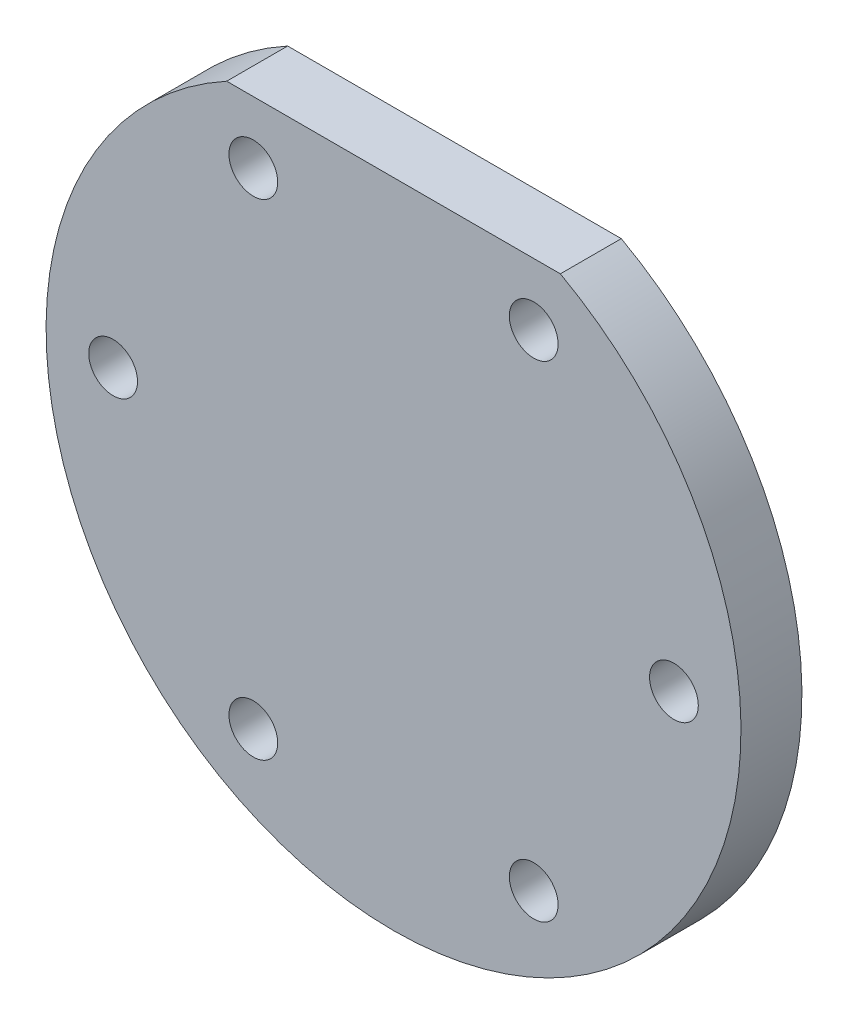
ISO-10303-21;
HEADER;
FILE_DESCRIPTION(('STEP AP214'),'2;1');
FILE_NAME('part.step','',(''),(''),'','','');
FILE_SCHEMA(('AUTOMOTIVE_DESIGN { 1 0 10303 214 1 1 1 1 }'));
ENDSEC;
DATA;
#1=APPLICATION_CONTEXT('core data for automotive mechanical design processes');
#2=APPLICATION_PROTOCOL_DEFINITION('international standard','automotive_design',2000,#1);
#3=PRODUCT_CONTEXT('',#1,'mechanical');
#4=PRODUCT('Part','Part','',(#3));
#5=PRODUCT_RELATED_PRODUCT_CATEGORY('part','',(#4));
#6=PRODUCT_DEFINITION_FORMATION('','',#4);
#7=PRODUCT_DEFINITION_CONTEXT('part definition',#1,'design');
#8=PRODUCT_DEFINITION('design','',#6,#7);
#9=PRODUCT_DEFINITION_SHAPE('','',#8);
#10=(LENGTH_UNIT() NAMED_UNIT(*) SI_UNIT(.MILLI.,.METRE.));
#11=(NAMED_UNIT(*) PLANE_ANGLE_UNIT() SI_UNIT($,.RADIAN.));
#12=(NAMED_UNIT(*) SI_UNIT($,.STERADIAN.) SOLID_ANGLE_UNIT());
#13=UNCERTAINTY_MEASURE_WITH_UNIT(LENGTH_MEASURE(1.E-05),#10,'distance_accuracy_value','');
#14=(GEOMETRIC_REPRESENTATION_CONTEXT(3) GLOBAL_UNCERTAINTY_ASSIGNED_CONTEXT((#13)) GLOBAL_UNIT_ASSIGNED_CONTEXT((#10,
#11,#12)) REPRESENTATION_CONTEXT('',''));
#15=CARTESIAN_POINT('',(0.,0.,0.));
#16=DIRECTION('',(0.,0.,1.));
#17=DIRECTION('',(1.,0.,0.));
#18=AXIS2_PLACEMENT_3D('',#15,#16,#17);
#19=CARTESIAN_POINT('',(0.,0.,5.));
#20=DIRECTION('',(0.,0.,1.));
#21=DIRECTION('',(1.,0.,0.));
#22=AXIS2_PLACEMENT_3D('',#19,#20,#21);
#23=PLANE('',#22);
#24=CARTESIAN_POINT('',(-11.4999999999998,19.9185842870422,5.));
#25=DIRECTION('',(0.,0.,1.));
#26=DIRECTION('',(1.,0.,0.));
#27=AXIS2_PLACEMENT_3D('',#24,#25,#26);
#28=CIRCLE('',#27,2.);
#29=CARTESIAN_POINT('',(-9.49999999999981,19.9185842870422,5.));
#30=VERTEX_POINT('',#29);
#31=EDGE_CURVE('E121',#30,#30,#28,.T.);
#32=ORIENTED_EDGE('',*,*,#31,.F.);
#33=EDGE_LOOP('',(#32));
#34=FACE_BOUND('',#33,.T.);
#35=CARTESIAN_POINT('',(-11.5000000000001,-19.918584287042,5.));
#36=DIRECTION('',(0.,0.,1.));
#37=DIRECTION('',(1.,0.,0.));
#38=AXIS2_PLACEMENT_3D('',#35,#36,#37);
#39=CIRCLE('',#38,2.00000000000001);
#40=CARTESIAN_POINT('',(-9.50000000000009,-19.918584287042,5.));
#41=VERTEX_POINT('',#40);
#42=EDGE_CURVE('E105',#41,#41,#39,.T.);
#43=ORIENTED_EDGE('',*,*,#42,.F.);
#44=EDGE_LOOP('',(#43));
#45=FACE_BOUND('',#44,.T.);
#46=CARTESIAN_POINT('',(23.,0.,5.));
#47=DIRECTION('',(0.,0.,1.));
#48=DIRECTION('',(1.,0.,0.));
#49=AXIS2_PLACEMENT_3D('',#46,#47,#48);
#50=CIRCLE('',#49,2.);
#51=CARTESIAN_POINT('',(25.,0.,5.));
#52=VERTEX_POINT('',#51);
#53=EDGE_CURVE('E86',#52,#52,#50,.T.);
#54=ORIENTED_EDGE('',*,*,#53,.F.);
#55=EDGE_LOOP('',(#54));
#56=FACE_BOUND('',#55,.T.);
#57=CARTESIAN_POINT('',(0.,0.,5.));
#58=DIRECTION('',(0.,0.,1.));
#59=DIRECTION('',(1.,0.,0.));
#60=AXIS2_PLACEMENT_3D('',#57,#58,#59);
#61=CIRCLE('',#60,28.5);
#62=CARTESIAN_POINT('',(-13.683932183404,25.,5.));
#63=VERTEX_POINT('',#62);
#64=CARTESIAN_POINT('',(13.683932183404,25.,5.));
#65=VERTEX_POINT('',#64);
#66=EDGE_CURVE('E78',#63,#65,#61,.T.);
#67=ORIENTED_EDGE('',*,*,#66,.T.);
#68=DIRECTION('',(-1.,0.,0.));
#69=VECTOR('',#68,1.);
#70=CARTESIAN_POINT('',(-13.683932183404,25.,5.));
#71=LINE('',#70,#69);
#72=EDGE_CURVE('E62',#65,#63,#71,.T.);
#73=ORIENTED_EDGE('',*,*,#72,.T.);
#74=EDGE_LOOP('',(#67,#73));
#75=FACE_BOUND('',#74,.T.);
#76=CARTESIAN_POINT('',(11.5,-19.9185842870421,5.));
#77=DIRECTION('',(0.,0.,1.));
#78=DIRECTION('',(1.,0.,0.));
#79=AXIS2_PLACEMENT_3D('',#76,#77,#78);
#80=CIRCLE('',#79,2.);
#81=CARTESIAN_POINT('',(13.5,-19.9185842870421,5.));
#82=VERTEX_POINT('',#81);
#83=EDGE_CURVE('E99',#82,#82,#80,.T.);
#84=ORIENTED_EDGE('',*,*,#83,.F.);
#85=EDGE_LOOP('',(#84));
#86=FACE_BOUND('',#85,.T.);
#87=CARTESIAN_POINT('',(-23.,1.60608141586784E-13,5.));
#88=DIRECTION('',(0.,0.,1.));
#89=DIRECTION('',(1.,0.,0.));
#90=AXIS2_PLACEMENT_3D('',#87,#88,#89);
#91=CIRCLE('',#90,2.);
#92=CARTESIAN_POINT('',(-21.,1.60608141586784E-13,5.));
#93=VERTEX_POINT('',#92);
#94=EDGE_CURVE('E113',#93,#93,#91,.T.);
#95=ORIENTED_EDGE('',*,*,#94,.F.);
#96=EDGE_LOOP('',(#95));
#97=FACE_BOUND('',#96,.T.);
#98=CARTESIAN_POINT('',(11.5000000000002,19.918584287042,5.));
#99=DIRECTION('',(0.,0.,1.));
#100=DIRECTION('',(1.,0.,0.));
#101=AXIS2_PLACEMENT_3D('',#98,#99,#100);
#102=CIRCLE('',#101,2.);
#103=CARTESIAN_POINT('',(13.5000000000002,19.918584287042,5.));
#104=VERTEX_POINT('',#103);
#105=EDGE_CURVE('E129',#104,#104,#102,.T.);
#106=ORIENTED_EDGE('',*,*,#105,.F.);
#107=EDGE_LOOP('',(#106));
#108=FACE_BOUND('',#107,.T.);
#109=ADVANCED_FACE('F45',(#34,#45,#56,#75,#86,#97,#108),#23,.T.);
#110=CARTESIAN_POINT('',(0.,0.,0.));
#111=DIRECTION('',(0.,0.,1.));
#112=DIRECTION('',(1.,0.,0.));
#113=AXIS2_PLACEMENT_3D('',#110,#111,#112);
#114=PLANE('',#113);
#115=CARTESIAN_POINT('',(0.,0.,0.));
#116=DIRECTION('',(0.,0.,1.));
#117=DIRECTION('',(1.,0.,0.));
#118=AXIS2_PLACEMENT_3D('',#115,#116,#117);
#119=CIRCLE('',#118,28.5);
#120=CARTESIAN_POINT('',(-13.683932183404,25.,0.));
#121=VERTEX_POINT('',#120);
#122=CARTESIAN_POINT('',(13.683932183404,25.,0.));
#123=VERTEX_POINT('',#122);
#124=EDGE_CURVE('E79',#121,#123,#119,.T.);
#125=ORIENTED_EDGE('',*,*,#124,.F.);
#126=DIRECTION('',(-1.,0.,0.));
#127=VECTOR('',#126,1.);
#128=CARTESIAN_POINT('',(-13.683932183404,25.,0.));
#129=LINE('',#128,#127);
#130=EDGE_CURVE('E70',#123,#121,#129,.T.);
#131=ORIENTED_EDGE('',*,*,#130,.F.);
#132=EDGE_LOOP('',(#125,#131));
#133=FACE_BOUND('',#132,.T.);
#134=CARTESIAN_POINT('',(23.,0.,0.));
#135=DIRECTION('',(0.,0.,1.));
#136=DIRECTION('',(1.,0.,0.));
#137=AXIS2_PLACEMENT_3D('',#134,#135,#136);
#138=CIRCLE('',#137,2.);
#139=CARTESIAN_POINT('',(25.,0.,0.));
#140=VERTEX_POINT('',#139);
#141=EDGE_CURVE('E90',#140,#140,#138,.T.);
#142=ORIENTED_EDGE('',*,*,#141,.T.);
#143=EDGE_LOOP('',(#142));
#144=FACE_BOUND('',#143,.T.);
#145=CARTESIAN_POINT('',(11.5,-19.9185842870421,0.));
#146=DIRECTION('',(0.,0.,1.));
#147=DIRECTION('',(1.,0.,0.));
#148=AXIS2_PLACEMENT_3D('',#145,#146,#147);
#149=CIRCLE('',#148,2.);
#150=CARTESIAN_POINT('',(13.5,-19.9185842870421,0.));
#151=VERTEX_POINT('',#150);
#152=EDGE_CURVE('E101',#151,#151,#149,.T.);
#153=ORIENTED_EDGE('',*,*,#152,.T.);
#154=EDGE_LOOP('',(#153));
#155=FACE_BOUND('',#154,.T.);
#156=CARTESIAN_POINT('',(-11.5000000000001,-19.918584287042,0.));
#157=DIRECTION('',(0.,0.,1.));
#158=DIRECTION('',(1.,0.,0.));
#159=AXIS2_PLACEMENT_3D('',#156,#157,#158);
#160=CIRCLE('',#159,2.00000000000001);
#161=CARTESIAN_POINT('',(-9.50000000000009,-19.918584287042,0.));
#162=VERTEX_POINT('',#161);
#163=EDGE_CURVE('E109',#162,#162,#160,.T.);
#164=ORIENTED_EDGE('',*,*,#163,.T.);
#165=EDGE_LOOP('',(#164));
#166=FACE_BOUND('',#165,.T.);
#167=CARTESIAN_POINT('',(-23.,1.60608141586784E-13,0.));
#168=DIRECTION('',(0.,0.,1.));
#169=DIRECTION('',(1.,0.,0.));
#170=AXIS2_PLACEMENT_3D('',#167,#168,#169);
#171=CIRCLE('',#170,2.);
#172=CARTESIAN_POINT('',(-21.,1.60608141586784E-13,0.));
#173=VERTEX_POINT('',#172);
#174=EDGE_CURVE('E117',#173,#173,#171,.T.);
#175=ORIENTED_EDGE('',*,*,#174,.T.);
#176=EDGE_LOOP('',(#175));
#177=FACE_BOUND('',#176,.T.);
#178=CARTESIAN_POINT('',(-11.4999999999998,19.9185842870422,0.));
#179=DIRECTION('',(0.,0.,1.));
#180=DIRECTION('',(1.,0.,0.));
#181=AXIS2_PLACEMENT_3D('',#178,#179,#180);
#182=CIRCLE('',#181,2.);
#183=CARTESIAN_POINT('',(-9.49999999999981,19.9185842870422,0.));
#184=VERTEX_POINT('',#183);
#185=EDGE_CURVE('E125',#184,#184,#182,.T.);
#186=ORIENTED_EDGE('',*,*,#185,.T.);
#187=EDGE_LOOP('',(#186));
#188=FACE_BOUND('',#187,.T.);
#189=CARTESIAN_POINT('',(11.5000000000002,19.918584287042,0.));
#190=DIRECTION('',(0.,0.,1.));
#191=DIRECTION('',(1.,0.,0.));
#192=AXIS2_PLACEMENT_3D('',#189,#190,#191);
#193=CIRCLE('',#192,2.);
#194=CARTESIAN_POINT('',(13.5000000000002,19.918584287042,0.));
#195=VERTEX_POINT('',#194);
#196=EDGE_CURVE('E133',#195,#195,#193,.T.);
#197=ORIENTED_EDGE('',*,*,#196,.T.);
#198=EDGE_LOOP('',(#197));
#199=FACE_BOUND('',#198,.T.);
#200=ADVANCED_FACE('F83',(#133,#144,#155,#166,#177,#188,#199),#114,.F.);
#201=CARTESIAN_POINT('',(0.,0.,5.));
#202=DIRECTION('',(0.,0.,-1.));
#203=DIRECTION('',(-1.,0.,0.));
#204=AXIS2_PLACEMENT_3D('',#201,#202,#203);
#205=CYLINDRICAL_SURFACE('',#204,28.5);
#206=ORIENTED_EDGE('',*,*,#124,.T.);
#207=DIRECTION('',(0.,0.,-1.));
#208=VECTOR('',#207,1.);
#209=CARTESIAN_POINT('',(13.683932183404,25.,5.));
#210=LINE('',#209,#208);
#211=EDGE_CURVE('E11',#65,#123,#210,.T.);
#212=ORIENTED_EDGE('',*,*,#211,.F.);
#213=ORIENTED_EDGE('',*,*,#66,.F.);
#214=DIRECTION('',(0.,0.,-1.));
#215=VECTOR('',#214,1.);
#216=CARTESIAN_POINT('',(-13.683932183404,25.,5.));
#217=LINE('',#216,#215);
#218=EDGE_CURVE('E55',#63,#121,#217,.T.);
#219=ORIENTED_EDGE('',*,*,#218,.T.);
#220=EDGE_LOOP('',(#206,#212,#213,#219));
#221=FACE_BOUND('',#220,.T.);
#222=ADVANCED_FACE('F47',(#221),#205,.T.);
#223=CARTESIAN_POINT('',(-13.683932183404,25.,5.));
#224=DIRECTION('',(0.,-1.,0.));
#225=DIRECTION('',(0.,0.,-1.));
#226=AXIS2_PLACEMENT_3D('',#223,#224,#225);
#227=PLANE('',#226);
#228=ORIENTED_EDGE('',*,*,#130,.T.);
#229=ORIENTED_EDGE('',*,*,#218,.F.);
#230=ORIENTED_EDGE('',*,*,#72,.F.);
#231=ORIENTED_EDGE('',*,*,#211,.T.);
#232=EDGE_LOOP('',(#228,#229,#230,#231));
#233=FACE_BOUND('',#232,.T.);
#234=ADVANCED_FACE('F73',(#233),#227,.F.);
#235=CARTESIAN_POINT('',(23.,0.,5.));
#236=DIRECTION('',(0.,0.,-1.));
#237=DIRECTION('',(-1.,0.,0.));
#238=AXIS2_PLACEMENT_3D('',#235,#236,#237);
#239=CYLINDRICAL_SURFACE('',#238,2.);
#240=ORIENTED_EDGE('',*,*,#53,.T.);
#241=EDGE_LOOP('',(#240));
#242=FACE_BOUND('',#241,.T.);
#243=ORIENTED_EDGE('',*,*,#141,.F.);
#244=EDGE_LOOP('',(#243));
#245=FACE_BOUND('',#244,.T.);
#246=ADVANCED_FACE('F154',(#242,#245),#239,.F.);
#247=CARTESIAN_POINT('',(11.5,-19.9185842870421,5.));
#248=DIRECTION('',(0.,0.,-1.));
#249=DIRECTION('',(-1.,0.,0.));
#250=AXIS2_PLACEMENT_3D('',#247,#248,#249);
#251=CYLINDRICAL_SURFACE('',#250,2.);
#252=ORIENTED_EDGE('',*,*,#83,.T.);
#253=EDGE_LOOP('',(#252));
#254=FACE_BOUND('',#253,.T.);
#255=ORIENTED_EDGE('',*,*,#152,.F.);
#256=EDGE_LOOP('',(#255));
#257=FACE_BOUND('',#256,.T.);
#258=ADVANCED_FACE('F161',(#254,#257),#251,.F.);
#259=CARTESIAN_POINT('',(-11.5000000000001,-19.918584287042,5.));
#260=DIRECTION('',(0.,0.,-1.));
#261=DIRECTION('',(-1.,0.,0.));
#262=AXIS2_PLACEMENT_3D('',#259,#260,#261);
#263=CYLINDRICAL_SURFACE('',#262,2.00000000000001);
#264=ORIENTED_EDGE('',*,*,#42,.T.);
#265=EDGE_LOOP('',(#264));
#266=FACE_BOUND('',#265,.T.);
#267=ORIENTED_EDGE('',*,*,#163,.F.);
#268=EDGE_LOOP('',(#267));
#269=FACE_BOUND('',#268,.T.);
#270=ADVANCED_FACE('F193',(#266,#269),#263,.F.);
#271=CARTESIAN_POINT('',(-23.,1.60608141586784E-13,5.));
#272=DIRECTION('',(0.,0.,-1.));
#273=DIRECTION('',(-1.,0.,0.));
#274=AXIS2_PLACEMENT_3D('',#271,#272,#273);
#275=CYLINDRICAL_SURFACE('',#274,2.);
#276=ORIENTED_EDGE('',*,*,#94,.T.);
#277=EDGE_LOOP('',(#276));
#278=FACE_BOUND('',#277,.T.);
#279=ORIENTED_EDGE('',*,*,#174,.F.);
#280=EDGE_LOOP('',(#279));
#281=FACE_BOUND('',#280,.T.);
#282=ADVANCED_FACE('F201',(#278,#281),#275,.F.);
#283=CARTESIAN_POINT('',(-11.4999999999998,19.9185842870422,5.));
#284=DIRECTION('',(0.,0.,-1.));
#285=DIRECTION('',(-1.,0.,0.));
#286=AXIS2_PLACEMENT_3D('',#283,#284,#285);
#287=CYLINDRICAL_SURFACE('',#286,2.);
#288=ORIENTED_EDGE('',*,*,#31,.T.);
#289=EDGE_LOOP('',(#288));
#290=FACE_BOUND('',#289,.T.);
#291=ORIENTED_EDGE('',*,*,#185,.F.);
#292=EDGE_LOOP('',(#291));
#293=FACE_BOUND('',#292,.T.);
#294=ADVANCED_FACE('F210',(#290,#293),#287,.F.);
#295=CARTESIAN_POINT('',(11.5000000000002,19.918584287042,5.));
#296=DIRECTION('',(0.,0.,-1.));
#297=DIRECTION('',(-1.,0.,0.));
#298=AXIS2_PLACEMENT_3D('',#295,#296,#297);
#299=CYLINDRICAL_SURFACE('',#298,2.);
#300=ORIENTED_EDGE('',*,*,#105,.T.);
#301=EDGE_LOOP('',(#300));
#302=FACE_BOUND('',#301,.T.);
#303=ORIENTED_EDGE('',*,*,#196,.F.);
#304=EDGE_LOOP('',(#303));
#305=FACE_BOUND('',#304,.T.);
#306=ADVANCED_FACE('F141',(#302,#305),#299,.F.);
#307=CLOSED_SHELL('',(#109,#200,#222,#234,#246,#258,#270,#282,#294,#306));
#308=MANIFOLD_SOLID_BREP('B2',#307);
#309=ADVANCED_BREP_SHAPE_REPRESENTATION('',(#18,#308),#14);
#310=SHAPE_DEFINITION_REPRESENTATION(#9,#309);
ENDSEC;
END-ISO-10303-21;
